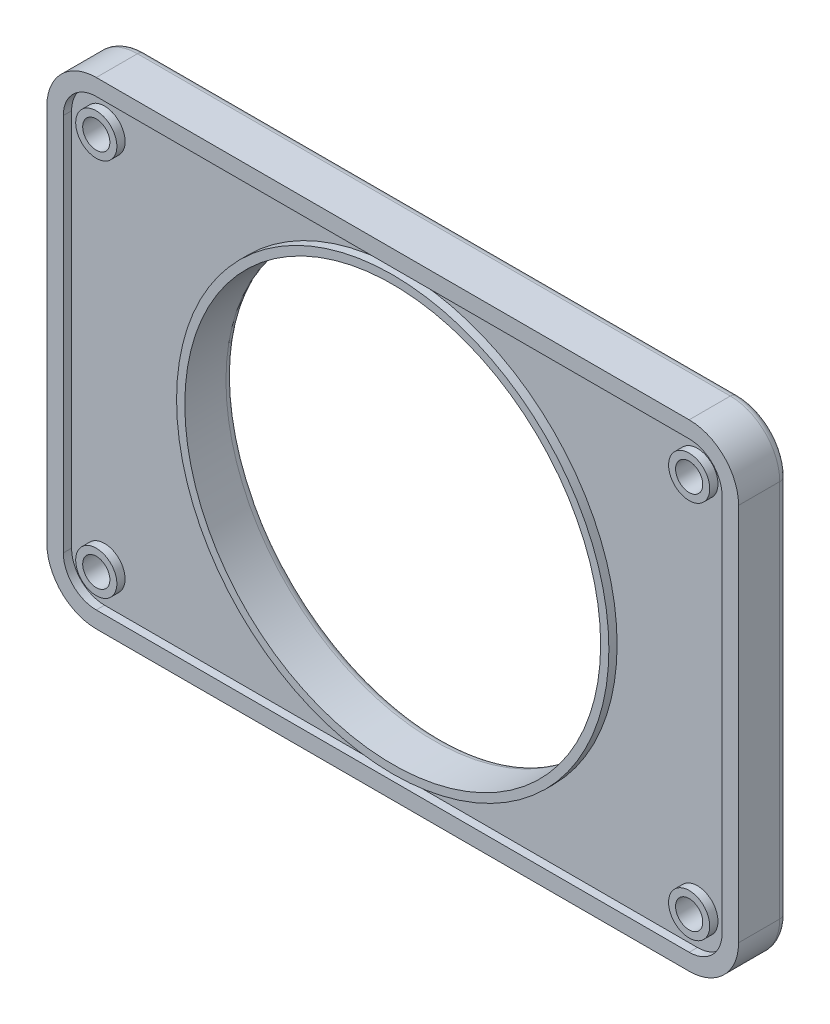
ISO-10303-21;
HEADER;
FILE_DESCRIPTION(('STEP AP214'),'2;1');
FILE_NAME('part.step','',(''),(''),'','','');
FILE_SCHEMA(('AUTOMOTIVE_DESIGN { 1 0 10303 214 1 1 1 1 }'));
ENDSEC;
DATA;
#1=APPLICATION_CONTEXT('core data for automotive mechanical design processes');
#2=APPLICATION_PROTOCOL_DEFINITION('international standard','automotive_design',2000,#1);
#3=PRODUCT_CONTEXT('',#1,'mechanical');
#4=PRODUCT('Part','Part','',(#3));
#5=PRODUCT_RELATED_PRODUCT_CATEGORY('part','',(#4));
#6=PRODUCT_DEFINITION_FORMATION('','',#4);
#7=PRODUCT_DEFINITION_CONTEXT('part definition',#1,'design');
#8=PRODUCT_DEFINITION('design','',#6,#7);
#9=PRODUCT_DEFINITION_SHAPE('','',#8);
#10=(LENGTH_UNIT() NAMED_UNIT(*) SI_UNIT(.MILLI.,.METRE.));
#11=(NAMED_UNIT(*) PLANE_ANGLE_UNIT() SI_UNIT($,.RADIAN.));
#12=(NAMED_UNIT(*) SI_UNIT($,.STERADIAN.) SOLID_ANGLE_UNIT());
#13=UNCERTAINTY_MEASURE_WITH_UNIT(LENGTH_MEASURE(1.E-05),#10,'distance_accuracy_value','');
#14=(GEOMETRIC_REPRESENTATION_CONTEXT(3) GLOBAL_UNCERTAINTY_ASSIGNED_CONTEXT((#13)) GLOBAL_UNIT_ASSIGNED_CONTEXT((#10,
#11,#12)) REPRESENTATION_CONTEXT('',''));
#15=CARTESIAN_POINT('',(0.,0.,0.));
#16=DIRECTION('',(0.,0.,1.));
#17=DIRECTION('',(1.,0.,0.));
#18=AXIS2_PLACEMENT_3D('',#15,#16,#17);
#19=CARTESIAN_POINT('',(36.,23.,5.));
#20=DIRECTION('',(0.,0.,1.));
#21=DIRECTION('',(1.,0.,0.));
#22=AXIS2_PLACEMENT_3D('',#19,#20,#21);
#23=PLANE('',#22);
#24=CARTESIAN_POINT('',(-36.,-23.,5.));
#25=DIRECTION('',(0.,0.,1.));
#26=DIRECTION('',(1.,0.,0.));
#27=AXIS2_PLACEMENT_3D('',#24,#25,#26);
#28=CIRCLE('',#27,2.5);
#29=CARTESIAN_POINT('',(-33.5,-23.,5.));
#30=VERTEX_POINT('',#29);
#31=EDGE_CURVE('E384',#30,#30,#28,.T.);
#32=ORIENTED_EDGE('',*,*,#31,.F.);
#33=EDGE_LOOP('',(#32));
#34=FACE_BOUND('',#33,.T.);
#35=CARTESIAN_POINT('',(-36.,23.,5.));
#36=DIRECTION('',(0.,0.,1.));
#37=DIRECTION('',(-1.,0.,0.));
#38=AXIS2_PLACEMENT_3D('',#35,#36,#37);
#39=CIRCLE('',#38,2.5);
#40=CARTESIAN_POINT('',(-38.5,23.,5.));
#41=VERTEX_POINT('',#40);
#42=EDGE_CURVE('E392',#41,#41,#39,.T.);
#43=ORIENTED_EDGE('',*,*,#42,.F.);
#44=EDGE_LOOP('',(#43));
#45=FACE_BOUND('',#44,.T.);
#46=CARTESIAN_POINT('',(36.,-23.,5.));
#47=DIRECTION('',(0.,0.,1.));
#48=DIRECTION('',(-1.,0.,0.));
#49=AXIS2_PLACEMENT_3D('',#46,#47,#48);
#50=CIRCLE('',#49,2.5);
#51=CARTESIAN_POINT('',(33.5,-23.,5.));
#52=VERTEX_POINT('',#51);
#53=EDGE_CURVE('E398',#52,#52,#50,.T.);
#54=ORIENTED_EDGE('',*,*,#53,.F.);
#55=EDGE_LOOP('',(#54));
#56=FACE_BOUND('',#55,.T.);
#57=CARTESIAN_POINT('',(36.,23.,5.));
#58=DIRECTION('',(0.,0.,1.));
#59=DIRECTION('',(1.,0.,0.));
#60=AXIS2_PLACEMENT_3D('',#57,#58,#59);
#61=CIRCLE('',#60,2.5);
#62=CARTESIAN_POINT('',(38.5,23.,5.));
#63=VERTEX_POINT('',#62);
#64=EDGE_CURVE('E404',#63,#63,#61,.T.);
#65=ORIENTED_EDGE('',*,*,#64,.F.);
#66=EDGE_LOOP('',(#65));
#67=FACE_BOUND('',#66,.T.);
#68=CARTESIAN_POINT('',(36.,23.,5.));
#69=DIRECTION('',(0.,0.,1.));
#70=DIRECTION('',(1.,0.,0.));
#71=AXIS2_PLACEMENT_3D('',#68,#69,#70);
#72=CIRCLE('',#71,4.);
#73=CARTESIAN_POINT('',(40.,23.,5.));
#74=VERTEX_POINT('',#73);
#75=CARTESIAN_POINT('',(36.,27.,5.));
#76=VERTEX_POINT('',#75);
#77=EDGE_CURVE('E179',#74,#76,#72,.T.);
#78=ORIENTED_EDGE('',*,*,#77,.T.);
#79=DIRECTION('',(-1.,0.,0.));
#80=VECTOR('',#79,1.);
#81=CARTESIAN_POINT('',(36.,27.,5.));
#82=LINE('',#81,#80);
#83=CARTESIAN_POINT('',(-36.,27.,5.));
#84=VERTEX_POINT('',#83);
#85=EDGE_CURVE('E190',#76,#84,#82,.T.);
#86=ORIENTED_EDGE('',*,*,#85,.T.);
#87=CARTESIAN_POINT('',(-36.,23.,5.));
#88=DIRECTION('',(0.,0.,1.));
#89=DIRECTION('',(1.,0.,0.));
#90=AXIS2_PLACEMENT_3D('',#87,#88,#89);
#91=CIRCLE('',#90,4.);
#92=CARTESIAN_POINT('',(-40.,23.,5.));
#93=VERTEX_POINT('',#92);
#94=EDGE_CURVE('E195',#84,#93,#91,.T.);
#95=ORIENTED_EDGE('',*,*,#94,.T.);
#96=DIRECTION('',(0.,-1.,0.));
#97=VECTOR('',#96,1.);
#98=CARTESIAN_POINT('',(-40.,23.,5.));
#99=LINE('',#98,#97);
#100=CARTESIAN_POINT('',(-40.,-23.,5.));
#101=VERTEX_POINT('',#100);
#102=EDGE_CURVE('E210',#93,#101,#99,.T.);
#103=ORIENTED_EDGE('',*,*,#102,.T.);
#104=CARTESIAN_POINT('',(-36.,-23.,5.));
#105=DIRECTION('',(0.,0.,1.));
#106=DIRECTION('',(1.,0.,0.));
#107=AXIS2_PLACEMENT_3D('',#104,#105,#106);
#108=CIRCLE('',#107,4.);
#109=CARTESIAN_POINT('',(-36.,-27.,5.));
#110=VERTEX_POINT('',#109);
#111=EDGE_CURVE('E213',#101,#110,#108,.T.);
#112=ORIENTED_EDGE('',*,*,#111,.T.);
#113=DIRECTION('',(1.,0.,0.));
#114=VECTOR('',#113,1.);
#115=CARTESIAN_POINT('',(-36.,-27.,5.));
#116=LINE('',#115,#114);
#117=CARTESIAN_POINT('',(36.,-27.,5.));
#118=VERTEX_POINT('',#117);
#119=EDGE_CURVE('E216',#110,#118,#116,.T.);
#120=ORIENTED_EDGE('',*,*,#119,.T.);
#121=CARTESIAN_POINT('',(36.,-23.,5.));
#122=DIRECTION('',(0.,0.,1.));
#123=DIRECTION('',(1.,0.,0.));
#124=AXIS2_PLACEMENT_3D('',#121,#122,#123);
#125=CIRCLE('',#124,4.);
#126=CARTESIAN_POINT('',(40.,-23.,5.));
#127=VERTEX_POINT('',#126);
#128=EDGE_CURVE('E219',#118,#127,#125,.T.);
#129=ORIENTED_EDGE('',*,*,#128,.T.);
#130=DIRECTION('',(0.,1.,0.));
#131=VECTOR('',#130,1.);
#132=CARTESIAN_POINT('',(40.,-23.,5.));
#133=LINE('',#132,#131);
#134=EDGE_CURVE('E187',#127,#74,#133,.T.);
#135=ORIENTED_EDGE('',*,*,#134,.T.);
#136=EDGE_LOOP('',(#78,#86,#95,#103,#112,#120,#129,#135));
#137=FACE_BOUND('',#136,.T.);
#138=CARTESIAN_POINT('',(0.,0.,5.));
#139=DIRECTION('',(0.,0.,1.));
#140=DIRECTION('',(1.,0.,0.));
#141=AXIS2_PLACEMENT_3D('',#138,#139,#140);
#142=CIRCLE('',#141,26.25);
#143=CARTESIAN_POINT('',(26.25,0.,5.));
#144=VERTEX_POINT('',#143);
#145=EDGE_CURVE('E206',#144,#144,#142,.T.);
#146=ORIENTED_EDGE('',*,*,#145,.F.);
#147=EDGE_LOOP('',(#146));
#148=FACE_BOUND('',#147,.T.);
#149=ADVANCED_FACE('F37',(#34,#45,#56,#67,#137,#148),#23,.T.);
#150=CARTESIAN_POINT('',(36.,23.,0.));
#151=DIRECTION('',(0.,0.,-1.));
#152=DIRECTION('',(-1.,0.,0.));
#153=AXIS2_PLACEMENT_3D('',#150,#151,#152);
#154=PLANE('',#153);
#155=CARTESIAN_POINT('',(0.,0.,0.));
#156=DIRECTION('',(0.,0.,-1.));
#157=DIRECTION('',(-1.,0.,0.));
#158=AXIS2_PLACEMENT_3D('',#155,#156,#157);
#159=CIRCLE('',#158,26.25);
#160=CARTESIAN_POINT('',(-26.25,0.,0.));
#161=VERTEX_POINT('',#160);
#162=EDGE_CURVE('E315',#161,#161,#159,.F.);
#163=ORIENTED_EDGE('',*,*,#162,.T.);
#164=EDGE_LOOP('',(#163));
#165=FACE_BOUND('',#164,.T.);
#166=CARTESIAN_POINT('',(-36.,23.,0.));
#167=DIRECTION('',(0.,0.,-1.));
#168=DIRECTION('',(-1.,0.,0.));
#169=AXIS2_PLACEMENT_3D('',#166,#167,#168);
#170=CIRCLE('',#169,5.);
#171=CARTESIAN_POINT('',(-41.,23.,0.));
#172=VERTEX_POINT('',#171);
#173=CARTESIAN_POINT('',(-36.,28.,0.));
#174=VERTEX_POINT('',#173);
#175=EDGE_CURVE('E310',#172,#174,#170,.T.);
#176=ORIENTED_EDGE('',*,*,#175,.T.);
#177=DIRECTION('',(-1.,0.,0.));
#178=VECTOR('',#177,1.);
#179=CARTESIAN_POINT('',(36.,28.,0.));
#180=LINE('',#179,#178);
#181=CARTESIAN_POINT('',(36.,28.,0.));
#182=VERTEX_POINT('',#181);
#183=EDGE_CURVE('E312',#174,#182,#180,.F.);
#184=ORIENTED_EDGE('',*,*,#183,.T.);
#185=CARTESIAN_POINT('',(36.,23.,0.));
#186=DIRECTION('',(0.,0.,-1.));
#187=DIRECTION('',(-1.,0.,0.));
#188=AXIS2_PLACEMENT_3D('',#185,#186,#187);
#189=CIRCLE('',#188,5.);
#190=CARTESIAN_POINT('',(41.,23.,0.));
#191=VERTEX_POINT('',#190);
#192=EDGE_CURVE('E298',#182,#191,#189,.T.);
#193=ORIENTED_EDGE('',*,*,#192,.T.);
#194=DIRECTION('',(0.,1.,0.));
#195=VECTOR('',#194,1.);
#196=CARTESIAN_POINT('',(41.,-23.,0.));
#197=LINE('',#196,#195);
#198=CARTESIAN_POINT('',(41.,-23.,0.));
#199=VERTEX_POINT('',#198);
#200=EDGE_CURVE('E300',#191,#199,#197,.F.);
#201=ORIENTED_EDGE('',*,*,#200,.T.);
#202=CARTESIAN_POINT('',(36.,-23.,0.));
#203=DIRECTION('',(0.,0.,-1.));
#204=DIRECTION('',(-1.,0.,0.));
#205=AXIS2_PLACEMENT_3D('',#202,#203,#204);
#206=CIRCLE('',#205,5.);
#207=CARTESIAN_POINT('',(36.,-28.,0.));
#208=VERTEX_POINT('',#207);
#209=EDGE_CURVE('E302',#199,#208,#206,.T.);
#210=ORIENTED_EDGE('',*,*,#209,.T.);
#211=DIRECTION('',(1.,0.,0.));
#212=VECTOR('',#211,1.);
#213=CARTESIAN_POINT('',(-35.9999999999999,-28.,0.));
#214=LINE('',#213,#212);
#215=CARTESIAN_POINT('',(-36.,-28.,0.));
#216=VERTEX_POINT('',#215);
#217=EDGE_CURVE('E304',#208,#216,#214,.F.);
#218=ORIENTED_EDGE('',*,*,#217,.T.);
#219=CARTESIAN_POINT('',(-36.,-23.,0.));
#220=DIRECTION('',(0.,0.,-1.));
#221=DIRECTION('',(-1.,0.,0.));
#222=AXIS2_PLACEMENT_3D('',#219,#220,#221);
#223=CIRCLE('',#222,5.);
#224=CARTESIAN_POINT('',(-41.,-23.,0.));
#225=VERTEX_POINT('',#224);
#226=EDGE_CURVE('E306',#216,#225,#223,.T.);
#227=ORIENTED_EDGE('',*,*,#226,.T.);
#228=DIRECTION('',(0.,-1.,0.));
#229=VECTOR('',#228,1.);
#230=CARTESIAN_POINT('',(-41.,23.,0.));
#231=LINE('',#230,#229);
#232=EDGE_CURVE('E308',#225,#172,#231,.F.);
#233=ORIENTED_EDGE('',*,*,#232,.T.);
#234=EDGE_LOOP('',(#176,#184,#193,#201,#210,#218,#227,#233));
#235=FACE_BOUND('',#234,.T.);
#236=ADVANCED_FACE('F420',(#165,#235),#154,.T.);
#237=CARTESIAN_POINT('',(36.,23.,5.));
#238=DIRECTION('',(0.,0.,-1.));
#239=DIRECTION('',(-1.,0.,0.));
#240=AXIS2_PLACEMENT_3D('',#237,#238,#239);
#241=CYLINDRICAL_SURFACE('',#240,6.);
#242=DIRECTION('',(0.,0.,-1.));
#243=VECTOR('',#242,1.);
#244=CARTESIAN_POINT('',(42.,23.,5.));
#245=LINE('',#244,#243);
#246=CARTESIAN_POINT('',(42.,23.,6.));
#247=VERTEX_POINT('',#246);
#248=CARTESIAN_POINT('',(42.,23.,1.));
#249=VERTEX_POINT('',#248);
#250=EDGE_CURVE('E277',#247,#249,#245,.T.);
#251=ORIENTED_EDGE('',*,*,#250,.T.);
#252=CARTESIAN_POINT('',(36.,23.,1.));
#253=DIRECTION('',(0.,0.,-1.));
#254=DIRECTION('',(-1.,0.,0.));
#255=AXIS2_PLACEMENT_3D('',#252,#253,#254);
#256=CIRCLE('',#255,6.);
#257=CARTESIAN_POINT('',(36.,29.,1.));
#258=VERTEX_POINT('',#257);
#259=EDGE_CURVE('E11',#249,#258,#256,.F.);
#260=ORIENTED_EDGE('',*,*,#259,.T.);
#261=DIRECTION('',(0.,0.,-1.));
#262=VECTOR('',#261,1.);
#263=CARTESIAN_POINT('',(36.,29.,5.));
#264=LINE('',#263,#262);
#265=CARTESIAN_POINT('',(36.,29.,6.));
#266=VERTEX_POINT('',#265);
#267=EDGE_CURVE('E295',#266,#258,#264,.T.);
#268=ORIENTED_EDGE('',*,*,#267,.F.);
#269=CARTESIAN_POINT('',(36.,23.,6.));
#270=DIRECTION('',(0.,0.,1.));
#271=DIRECTION('',(1.,0.,0.));
#272=AXIS2_PLACEMENT_3D('',#269,#270,#271);
#273=CIRCLE('',#272,6.);
#274=EDGE_CURVE('E242',#247,#266,#273,.T.);
#275=ORIENTED_EDGE('',*,*,#274,.F.);
#276=EDGE_LOOP('',(#251,#260,#268,#275));
#277=FACE_BOUND('',#276,.T.);
#278=ADVANCED_FACE('F426',(#277),#241,.T.);
#279=CARTESIAN_POINT('',(-36.,29.,5.));
#280=DIRECTION('',(0.,-1.,0.));
#281=DIRECTION('',(1.,0.,0.));
#282=AXIS2_PLACEMENT_3D('',#279,#280,#281);
#283=PLANE('',#282);
#284=ORIENTED_EDGE('',*,*,#267,.T.);
#285=DIRECTION('',(-1.,0.,0.));
#286=VECTOR('',#285,1.);
#287=CARTESIAN_POINT('',(-36.,29.,1.));
#288=LINE('',#287,#286);
#289=CARTESIAN_POINT('',(-36.,29.,1.));
#290=VERTEX_POINT('',#289);
#291=EDGE_CURVE('E321',#258,#290,#288,.T.);
#292=ORIENTED_EDGE('',*,*,#291,.T.);
#293=DIRECTION('',(0.,0.,-1.));
#294=VECTOR('',#293,1.);
#295=CARTESIAN_POINT('',(-36.,29.,5.));
#296=LINE('',#295,#294);
#297=CARTESIAN_POINT('',(-36.,29.,6.));
#298=VERTEX_POINT('',#297);
#299=EDGE_CURVE('E292',#298,#290,#296,.T.);
#300=ORIENTED_EDGE('',*,*,#299,.F.);
#301=DIRECTION('',(-1.,0.,0.));
#302=VECTOR('',#301,1.);
#303=CARTESIAN_POINT('',(36.,29.,6.));
#304=LINE('',#303,#302);
#305=EDGE_CURVE('E256',#266,#298,#304,.T.);
#306=ORIENTED_EDGE('',*,*,#305,.F.);
#307=EDGE_LOOP('',(#284,#292,#300,#306));
#308=FACE_BOUND('',#307,.T.);
#309=ADVANCED_FACE('F492',(#308),#283,.F.);
#310=CARTESIAN_POINT('',(-36.,23.,5.));
#311=DIRECTION('',(0.,0.,-1.));
#312=DIRECTION('',(-1.,0.,0.));
#313=AXIS2_PLACEMENT_3D('',#310,#311,#312);
#314=CYLINDRICAL_SURFACE('',#313,6.);
#315=ORIENTED_EDGE('',*,*,#299,.T.);
#316=CARTESIAN_POINT('',(-36.,23.,1.));
#317=DIRECTION('',(0.,0.,-1.));
#318=DIRECTION('',(-1.,0.,0.));
#319=AXIS2_PLACEMENT_3D('',#316,#317,#318);
#320=CIRCLE('',#319,6.);
#321=CARTESIAN_POINT('',(-42.,23.,1.));
#322=VERTEX_POINT('',#321);
#323=EDGE_CURVE('E324',#290,#322,#320,.F.);
#324=ORIENTED_EDGE('',*,*,#323,.T.);
#325=DIRECTION('',(0.,0.,-1.));
#326=VECTOR('',#325,1.);
#327=CARTESIAN_POINT('',(-42.,23.,5.));
#328=LINE('',#327,#326);
#329=CARTESIAN_POINT('',(-42.,23.,6.));
#330=VERTEX_POINT('',#329);
#331=EDGE_CURVE('E289',#330,#322,#328,.T.);
#332=ORIENTED_EDGE('',*,*,#331,.F.);
#333=CARTESIAN_POINT('',(-36.,23.,6.));
#334=DIRECTION('',(0.,0.,1.));
#335=DIRECTION('',(1.,0.,0.));
#336=AXIS2_PLACEMENT_3D('',#333,#334,#335);
#337=CIRCLE('',#336,6.);
#338=EDGE_CURVE('E259',#298,#330,#337,.T.);
#339=ORIENTED_EDGE('',*,*,#338,.F.);
#340=EDGE_LOOP('',(#315,#324,#332,#339));
#341=FACE_BOUND('',#340,.T.);
#342=ADVANCED_FACE('F488',(#341),#314,.T.);
#343=CARTESIAN_POINT('',(-42.,23.,5.));
#344=DIRECTION('',(1.,0.,0.));
#345=DIRECTION('',(0.,1.,0.));
#346=AXIS2_PLACEMENT_3D('',#343,#344,#345);
#347=PLANE('',#346);
#348=ORIENTED_EDGE('',*,*,#331,.T.);
#349=DIRECTION('',(0.,-1.,0.));
#350=VECTOR('',#349,1.);
#351=CARTESIAN_POINT('',(-42.,-23.,1.));
#352=LINE('',#351,#350);
#353=CARTESIAN_POINT('',(-42.,-23.,1.));
#354=VERTEX_POINT('',#353);
#355=EDGE_CURVE('E326',#322,#354,#352,.T.);
#356=ORIENTED_EDGE('',*,*,#355,.T.);
#357=DIRECTION('',(0.,0.,-1.));
#358=VECTOR('',#357,1.);
#359=CARTESIAN_POINT('',(-42.,-23.,5.));
#360=LINE('',#359,#358);
#361=CARTESIAN_POINT('',(-42.,-23.,6.));
#362=VERTEX_POINT('',#361);
#363=EDGE_CURVE('E286',#362,#354,#360,.T.);
#364=ORIENTED_EDGE('',*,*,#363,.F.);
#365=DIRECTION('',(0.,-1.,0.));
#366=VECTOR('',#365,1.);
#367=CARTESIAN_POINT('',(-42.,23.,6.));
#368=LINE('',#367,#366);
#369=EDGE_CURVE('E262',#330,#362,#368,.T.);
#370=ORIENTED_EDGE('',*,*,#369,.F.);
#371=EDGE_LOOP('',(#348,#356,#364,#370));
#372=FACE_BOUND('',#371,.T.);
#373=ADVANCED_FACE('F484',(#372),#347,.F.);
#374=CARTESIAN_POINT('',(-36.,-23.,5.));
#375=DIRECTION('',(0.,0.,-1.));
#376=DIRECTION('',(-1.,0.,0.));
#377=AXIS2_PLACEMENT_3D('',#374,#375,#376);
#378=CYLINDRICAL_SURFACE('',#377,6.);
#379=ORIENTED_EDGE('',*,*,#363,.T.);
#380=CARTESIAN_POINT('',(-36.,-23.,1.));
#381=DIRECTION('',(0.,0.,-1.));
#382=DIRECTION('',(-1.,0.,0.));
#383=AXIS2_PLACEMENT_3D('',#380,#381,#382);
#384=CIRCLE('',#383,6.);
#385=CARTESIAN_POINT('',(-35.9999999999999,-29.,1.));
#386=VERTEX_POINT('',#385);
#387=EDGE_CURVE('E328',#354,#386,#384,.F.);
#388=ORIENTED_EDGE('',*,*,#387,.T.);
#389=DIRECTION('',(0.,0.,-1.));
#390=VECTOR('',#389,1.);
#391=CARTESIAN_POINT('',(-35.9999999999999,-29.,5.));
#392=LINE('',#391,#390);
#393=CARTESIAN_POINT('',(-35.9999999999999,-29.,6.));
#394=VERTEX_POINT('',#393);
#395=EDGE_CURVE('E283',#394,#386,#392,.T.);
#396=ORIENTED_EDGE('',*,*,#395,.F.);
#397=CARTESIAN_POINT('',(-36.,-23.,6.));
#398=DIRECTION('',(0.,0.,1.));
#399=DIRECTION('',(1.,0.,0.));
#400=AXIS2_PLACEMENT_3D('',#397,#398,#399);
#401=CIRCLE('',#400,6.);
#402=EDGE_CURVE('E265',#362,#394,#401,.T.);
#403=ORIENTED_EDGE('',*,*,#402,.F.);
#404=EDGE_LOOP('',(#379,#388,#396,#403));
#405=FACE_BOUND('',#404,.T.);
#406=ADVANCED_FACE('F480',(#405),#378,.T.);
#407=CARTESIAN_POINT('',(-35.9999999999999,-29.,5.));
#408=DIRECTION('',(0.,1.,0.));
#409=DIRECTION('',(0.,0.,1.));
#410=AXIS2_PLACEMENT_3D('',#407,#408,#409);
#411=PLANE('',#410);
#412=ORIENTED_EDGE('',*,*,#395,.T.);
#413=DIRECTION('',(1.,0.,0.));
#414=VECTOR('',#413,1.);
#415=CARTESIAN_POINT('',(36.,-29.,1.));
#416=LINE('',#415,#414);
#417=CARTESIAN_POINT('',(36.,-29.,1.));
#418=VERTEX_POINT('',#417);
#419=EDGE_CURVE('E330',#386,#418,#416,.T.);
#420=ORIENTED_EDGE('',*,*,#419,.T.);
#421=DIRECTION('',(0.,0.,-1.));
#422=VECTOR('',#421,1.);
#423=CARTESIAN_POINT('',(36.,-29.,5.));
#424=LINE('',#423,#422);
#425=CARTESIAN_POINT('',(36.,-29.,6.));
#426=VERTEX_POINT('',#425);
#427=EDGE_CURVE('E281',#426,#418,#424,.T.);
#428=ORIENTED_EDGE('',*,*,#427,.F.);
#429=DIRECTION('',(1.,0.,0.));
#430=VECTOR('',#429,1.);
#431=CARTESIAN_POINT('',(-35.9999999999999,-29.,6.));
#432=LINE('',#431,#430);
#433=EDGE_CURVE('E268',#394,#426,#432,.T.);
#434=ORIENTED_EDGE('',*,*,#433,.F.);
#435=EDGE_LOOP('',(#412,#420,#428,#434));
#436=FACE_BOUND('',#435,.T.);
#437=ADVANCED_FACE('F477',(#436),#411,.F.);
#438=CARTESIAN_POINT('',(36.,-23.,5.));
#439=DIRECTION('',(0.,0.,-1.));
#440=DIRECTION('',(-1.,0.,0.));
#441=AXIS2_PLACEMENT_3D('',#438,#439,#440);
#442=CYLINDRICAL_SURFACE('',#441,6.);
#443=ORIENTED_EDGE('',*,*,#427,.T.);
#444=CARTESIAN_POINT('',(36.,-23.,1.));
#445=DIRECTION('',(0.,0.,-1.));
#446=DIRECTION('',(-1.,0.,0.));
#447=AXIS2_PLACEMENT_3D('',#444,#445,#446);
#448=CIRCLE('',#447,6.);
#449=CARTESIAN_POINT('',(42.,-23.,1.));
#450=VERTEX_POINT('',#449);
#451=EDGE_CURVE('E61',#418,#450,#448,.F.);
#452=ORIENTED_EDGE('',*,*,#451,.T.);
#453=DIRECTION('',(0.,0.,-1.));
#454=VECTOR('',#453,1.);
#455=CARTESIAN_POINT('',(42.,-23.,5.));
#456=LINE('',#455,#454);
#457=CARTESIAN_POINT('',(42.,-23.,6.));
#458=VERTEX_POINT('',#457);
#459=EDGE_CURVE('E279',#458,#450,#456,.T.);
#460=ORIENTED_EDGE('',*,*,#459,.F.);
#461=CARTESIAN_POINT('',(36.,-23.,6.));
#462=DIRECTION('',(0.,0.,1.));
#463=DIRECTION('',(1.,0.,0.));
#464=AXIS2_PLACEMENT_3D('',#461,#462,#463);
#465=CIRCLE('',#464,6.);
#466=EDGE_CURVE('E271',#426,#458,#465,.T.);
#467=ORIENTED_EDGE('',*,*,#466,.F.);
#468=EDGE_LOOP('',(#443,#452,#460,#467));
#469=FACE_BOUND('',#468,.T.);
#470=ADVANCED_FACE('F474',(#469),#442,.T.);
#471=CARTESIAN_POINT('',(42.,23.,5.));
#472=DIRECTION('',(-1.,0.,0.));
#473=DIRECTION('',(0.,-1.,0.));
#474=AXIS2_PLACEMENT_3D('',#471,#472,#473);
#475=PLANE('',#474);
#476=ORIENTED_EDGE('',*,*,#459,.T.);
#477=DIRECTION('',(0.,1.,0.));
#478=VECTOR('',#477,1.);
#479=CARTESIAN_POINT('',(42.,23.,1.));
#480=LINE('',#479,#478);
#481=EDGE_CURVE('E46',#450,#249,#480,.T.);
#482=ORIENTED_EDGE('',*,*,#481,.T.);
#483=ORIENTED_EDGE('',*,*,#250,.F.);
#484=DIRECTION('',(0.,1.,0.));
#485=VECTOR('',#484,1.);
#486=CARTESIAN_POINT('',(42.,-23.,6.));
#487=LINE('',#486,#485);
#488=EDGE_CURVE('E274',#458,#247,#487,.T.);
#489=ORIENTED_EDGE('',*,*,#488,.F.);
#490=EDGE_LOOP('',(#476,#482,#483,#489));
#491=FACE_BOUND('',#490,.T.);
#492=ADVANCED_FACE('F469',(#491),#475,.F.);
#493=CARTESIAN_POINT('',(0.,0.,5.));
#494=DIRECTION('',(0.,0.,-1.));
#495=DIRECTION('',(-1.,0.,0.));
#496=AXIS2_PLACEMENT_3D('',#493,#494,#495);
#497=CYLINDRICAL_SURFACE('',#496,25.25);
#498=CARTESIAN_POINT('',(0.,0.,1.));
#499=DIRECTION('',(0.,0.,-1.));
#500=DIRECTION('',(-1.,0.,0.));
#501=AXIS2_PLACEMENT_3D('',#498,#499,#500);
#502=CIRCLE('',#501,25.25);
#503=CARTESIAN_POINT('',(-25.25,0.,1.));
#504=VERTEX_POINT('',#503);
#505=EDGE_CURVE('E318',#504,#504,#502,.T.);
#506=ORIENTED_EDGE('',*,*,#505,.T.);
#507=EDGE_LOOP('',(#506));
#508=FACE_BOUND('',#507,.T.);
#509=CARTESIAN_POINT('',(0.,0.,6.));
#510=DIRECTION('',(0.,0.,1.));
#511=DIRECTION('',(1.,0.,0.));
#512=AXIS2_PLACEMENT_3D('',#509,#510,#511);
#513=CIRCLE('',#512,25.25);
#514=CARTESIAN_POINT('',(25.25,0.,6.));
#515=VERTEX_POINT('',#514);
#516=EDGE_CURVE('E410',#515,#515,#513,.T.);
#517=ORIENTED_EDGE('',*,*,#516,.T.);
#518=EDGE_LOOP('',(#517));
#519=FACE_BOUND('',#518,.T.);
#520=ADVANCED_FACE('F466',(#508,#519),#497,.F.);
#521=CARTESIAN_POINT('',(36.,23.,6.));
#522=DIRECTION('',(0.,0.,1.));
#523=DIRECTION('',(1.,0.,0.));
#524=AXIS2_PLACEMENT_3D('',#521,#522,#523);
#525=PLANE('',#524);
#526=CARTESIAN_POINT('',(36.,23.,6.));
#527=DIRECTION('',(0.,0.,1.));
#528=DIRECTION('',(1.,0.,0.));
#529=AXIS2_PLACEMENT_3D('',#526,#527,#528);
#530=CIRCLE('',#529,4.);
#531=CARTESIAN_POINT('',(40.,23.,6.));
#532=VERTEX_POINT('',#531);
#533=CARTESIAN_POINT('',(36.,27.,6.));
#534=VERTEX_POINT('',#533);
#535=EDGE_CURVE('E182',#532,#534,#530,.T.);
#536=ORIENTED_EDGE('',*,*,#535,.F.);
#537=DIRECTION('',(0.,1.,0.));
#538=VECTOR('',#537,1.);
#539=CARTESIAN_POINT('',(40.,-23.,6.));
#540=LINE('',#539,#538);
#541=CARTESIAN_POINT('',(40.,-23.,6.));
#542=VERTEX_POINT('',#541);
#543=EDGE_CURVE('E200',#542,#532,#540,.T.);
#544=ORIENTED_EDGE('',*,*,#543,.F.);
#545=CARTESIAN_POINT('',(36.,-23.,6.));
#546=DIRECTION('',(0.,0.,1.));
#547=DIRECTION('',(1.,0.,0.));
#548=AXIS2_PLACEMENT_3D('',#545,#546,#547);
#549=CIRCLE('',#548,4.);
#550=CARTESIAN_POINT('',(36.,-27.,6.));
#551=VERTEX_POINT('',#550);
#552=EDGE_CURVE('E203',#551,#542,#549,.T.);
#553=ORIENTED_EDGE('',*,*,#552,.F.);
#554=DIRECTION('',(1.,0.,0.));
#555=VECTOR('',#554,1.);
#556=CARTESIAN_POINT('',(-36.,-27.,6.));
#557=LINE('',#556,#555);
#558=CARTESIAN_POINT('',(-36.,-27.,6.));
#559=VERTEX_POINT('',#558);
#560=EDGE_CURVE('E235',#559,#551,#557,.T.);
#561=ORIENTED_EDGE('',*,*,#560,.F.);
#562=CARTESIAN_POINT('',(-36.,-23.,6.));
#563=DIRECTION('',(0.,0.,1.));
#564=DIRECTION('',(1.,0.,0.));
#565=AXIS2_PLACEMENT_3D('',#562,#563,#564);
#566=CIRCLE('',#565,4.);
#567=CARTESIAN_POINT('',(-40.,-23.,6.));
#568=VERTEX_POINT('',#567);
#569=EDGE_CURVE('E232',#568,#559,#566,.T.);
#570=ORIENTED_EDGE('',*,*,#569,.F.);
#571=DIRECTION('',(0.,-1.,0.));
#572=VECTOR('',#571,1.);
#573=CARTESIAN_POINT('',(-40.,23.,6.));
#574=LINE('',#573,#572);
#575=CARTESIAN_POINT('',(-40.,23.,6.));
#576=VERTEX_POINT('',#575);
#577=EDGE_CURVE('E229',#576,#568,#574,.T.);
#578=ORIENTED_EDGE('',*,*,#577,.F.);
#579=CARTESIAN_POINT('',(-36.,23.,6.));
#580=DIRECTION('',(0.,0.,1.));
#581=DIRECTION('',(1.,0.,0.));
#582=AXIS2_PLACEMENT_3D('',#579,#580,#581);
#583=CIRCLE('',#582,4.);
#584=CARTESIAN_POINT('',(-36.,27.,6.));
#585=VERTEX_POINT('',#584);
#586=EDGE_CURVE('E226',#585,#576,#583,.T.);
#587=ORIENTED_EDGE('',*,*,#586,.F.);
#588=DIRECTION('',(-1.,0.,0.));
#589=VECTOR('',#588,1.);
#590=CARTESIAN_POINT('',(36.,27.,6.));
#591=LINE('',#590,#589);
#592=EDGE_CURVE('E223',#534,#585,#591,.T.);
#593=ORIENTED_EDGE('',*,*,#592,.F.);
#594=EDGE_LOOP('',(#536,#544,#553,#561,#570,#578,#587,#593));
#595=FACE_BOUND('',#594,.T.);
#596=ORIENTED_EDGE('',*,*,#274,.T.);
#597=ORIENTED_EDGE('',*,*,#305,.T.);
#598=ORIENTED_EDGE('',*,*,#338,.T.);
#599=ORIENTED_EDGE('',*,*,#369,.T.);
#600=ORIENTED_EDGE('',*,*,#402,.T.);
#601=ORIENTED_EDGE('',*,*,#433,.T.);
#602=ORIENTED_EDGE('',*,*,#466,.T.);
#603=ORIENTED_EDGE('',*,*,#488,.T.);
#604=EDGE_LOOP('',(#596,#597,#598,#599,#600,#601,#602,#603));
#605=FACE_BOUND('',#604,.T.);
#606=ADVANCED_FACE('F463',(#595,#605),#525,.T.);
#607=CARTESIAN_POINT('',(36.,23.,5.));
#608=DIRECTION('',(0.,0.,1.));
#609=DIRECTION('',(1.,0.,0.));
#610=AXIS2_PLACEMENT_3D('',#607,#608,#609);
#611=CYLINDRICAL_SURFACE('',#610,4.);
#612=ORIENTED_EDGE('',*,*,#535,.T.);
#613=DIRECTION('',(0.,0.,1.));
#614=VECTOR('',#613,1.);
#615=CARTESIAN_POINT('',(36.,27.,5.));
#616=LINE('',#615,#614);
#617=EDGE_CURVE('E175',#76,#534,#616,.T.);
#618=ORIENTED_EDGE('',*,*,#617,.F.);
#619=ORIENTED_EDGE('',*,*,#77,.F.);
#620=DIRECTION('',(0.,0.,1.));
#621=VECTOR('',#620,1.);
#622=CARTESIAN_POINT('',(40.,23.,5.));
#623=LINE('',#622,#621);
#624=EDGE_CURVE('E240',#74,#532,#623,.T.);
#625=ORIENTED_EDGE('',*,*,#624,.T.);
#626=EDGE_LOOP('',(#612,#618,#619,#625));
#627=FACE_BOUND('',#626,.T.);
#628=ADVANCED_FACE('F177',(#627),#611,.F.);
#629=CARTESIAN_POINT('',(40.,-23.,5.));
#630=DIRECTION('',(1.,0.,0.));
#631=DIRECTION('',(0.,1.,0.));
#632=AXIS2_PLACEMENT_3D('',#629,#630,#631);
#633=PLANE('',#632);
#634=ORIENTED_EDGE('',*,*,#543,.T.);
#635=ORIENTED_EDGE('',*,*,#624,.F.);
#636=ORIENTED_EDGE('',*,*,#134,.F.);
#637=DIRECTION('',(0.,0.,1.));
#638=VECTOR('',#637,1.);
#639=CARTESIAN_POINT('',(40.,-23.,5.));
#640=LINE('',#639,#638);
#641=EDGE_CURVE('E243',#127,#542,#640,.T.);
#642=ORIENTED_EDGE('',*,*,#641,.T.);
#643=EDGE_LOOP('',(#634,#635,#636,#642));
#644=FACE_BOUND('',#643,.T.);
#645=ADVANCED_FACE('F434',(#644),#633,.F.);
#646=CARTESIAN_POINT('',(36.,-23.,5.));
#647=DIRECTION('',(0.,0.,1.));
#648=DIRECTION('',(1.,0.,0.));
#649=AXIS2_PLACEMENT_3D('',#646,#647,#648);
#650=CYLINDRICAL_SURFACE('',#649,4.);
#651=ORIENTED_EDGE('',*,*,#552,.T.);
#652=ORIENTED_EDGE('',*,*,#641,.F.);
#653=ORIENTED_EDGE('',*,*,#128,.F.);
#654=DIRECTION('',(0.,0.,1.));
#655=VECTOR('',#654,1.);
#656=CARTESIAN_POINT('',(36.,-27.,5.));
#657=LINE('',#656,#655);
#658=EDGE_CURVE('E245',#118,#551,#657,.T.);
#659=ORIENTED_EDGE('',*,*,#658,.T.);
#660=EDGE_LOOP('',(#651,#652,#653,#659));
#661=FACE_BOUND('',#660,.T.);
#662=ADVANCED_FACE('F437',(#661),#650,.F.);
#663=CARTESIAN_POINT('',(-36.,-27.,5.));
#664=DIRECTION('',(0.,-1.,0.));
#665=DIRECTION('',(1.,0.,0.));
#666=AXIS2_PLACEMENT_3D('',#663,#664,#665);
#667=PLANE('',#666);
#668=ORIENTED_EDGE('',*,*,#560,.T.);
#669=ORIENTED_EDGE('',*,*,#658,.F.);
#670=ORIENTED_EDGE('',*,*,#119,.F.);
#671=DIRECTION('',(0.,0.,1.));
#672=VECTOR('',#671,1.);
#673=CARTESIAN_POINT('',(-36.,-27.,5.));
#674=LINE('',#673,#672);
#675=EDGE_CURVE('E247',#110,#559,#674,.T.);
#676=ORIENTED_EDGE('',*,*,#675,.T.);
#677=EDGE_LOOP('',(#668,#669,#670,#676));
#678=FACE_BOUND('',#677,.T.);
#679=ADVANCED_FACE('F441',(#678),#667,.F.);
#680=CARTESIAN_POINT('',(-36.,-23.,5.));
#681=DIRECTION('',(0.,0.,1.));
#682=DIRECTION('',(1.,0.,0.));
#683=AXIS2_PLACEMENT_3D('',#680,#681,#682);
#684=CYLINDRICAL_SURFACE('',#683,4.);
#685=ORIENTED_EDGE('',*,*,#569,.T.);
#686=ORIENTED_EDGE('',*,*,#675,.F.);
#687=ORIENTED_EDGE('',*,*,#111,.F.);
#688=DIRECTION('',(0.,0.,1.));
#689=VECTOR('',#688,1.);
#690=CARTESIAN_POINT('',(-40.,-23.,5.));
#691=LINE('',#690,#689);
#692=EDGE_CURVE('E249',#101,#568,#691,.T.);
#693=ORIENTED_EDGE('',*,*,#692,.T.);
#694=EDGE_LOOP('',(#685,#686,#687,#693));
#695=FACE_BOUND('',#694,.T.);
#696=ADVANCED_FACE('F445',(#695),#684,.F.);
#697=CARTESIAN_POINT('',(-40.,23.,5.));
#698=DIRECTION('',(-1.,0.,0.));
#699=DIRECTION('',(0.,-1.,0.));
#700=AXIS2_PLACEMENT_3D('',#697,#698,#699);
#701=PLANE('',#700);
#702=ORIENTED_EDGE('',*,*,#577,.T.);
#703=ORIENTED_EDGE('',*,*,#692,.F.);
#704=ORIENTED_EDGE('',*,*,#102,.F.);
#705=DIRECTION('',(0.,0.,1.));
#706=VECTOR('',#705,1.);
#707=CARTESIAN_POINT('',(-40.,23.,5.));
#708=LINE('',#707,#706);
#709=EDGE_CURVE('E251',#93,#576,#708,.T.);
#710=ORIENTED_EDGE('',*,*,#709,.T.);
#711=EDGE_LOOP('',(#702,#703,#704,#710));
#712=FACE_BOUND('',#711,.T.);
#713=ADVANCED_FACE('F449',(#712),#701,.F.);
#714=CARTESIAN_POINT('',(-36.,23.,5.));
#715=DIRECTION('',(0.,0.,1.));
#716=DIRECTION('',(1.,0.,0.));
#717=AXIS2_PLACEMENT_3D('',#714,#715,#716);
#718=CYLINDRICAL_SURFACE('',#717,4.);
#719=ORIENTED_EDGE('',*,*,#586,.T.);
#720=ORIENTED_EDGE('',*,*,#709,.F.);
#721=ORIENTED_EDGE('',*,*,#94,.F.);
#722=DIRECTION('',(0.,0.,1.));
#723=VECTOR('',#722,1.);
#724=CARTESIAN_POINT('',(-36.,27.,5.));
#725=LINE('',#724,#723);
#726=EDGE_CURVE('E186',#84,#585,#725,.T.);
#727=ORIENTED_EDGE('',*,*,#726,.T.);
#728=EDGE_LOOP('',(#719,#720,#721,#727));
#729=FACE_BOUND('',#728,.T.);
#730=ADVANCED_FACE('F453',(#729),#718,.F.);
#731=CARTESIAN_POINT('',(36.,27.,5.));
#732=DIRECTION('',(0.,1.,0.));
#733=DIRECTION('',(0.,0.,1.));
#734=AXIS2_PLACEMENT_3D('',#731,#732,#733);
#735=PLANE('',#734);
#736=ORIENTED_EDGE('',*,*,#592,.T.);
#737=ORIENTED_EDGE('',*,*,#726,.F.);
#738=ORIENTED_EDGE('',*,*,#85,.F.);
#739=ORIENTED_EDGE('',*,*,#617,.T.);
#740=EDGE_LOOP('',(#736,#737,#738,#739));
#741=FACE_BOUND('',#740,.T.);
#742=ADVANCED_FACE('F191',(#741),#735,.F.);
#743=CARTESIAN_POINT('',(0.,0.,6.));
#744=DIRECTION('',(0.,0.,1.));
#745=DIRECTION('',(1.,0.,0.));
#746=AXIS2_PLACEMENT_3D('',#743,#744,#745);
#747=PLANE('',#746);
#748=CARTESIAN_POINT('',(0.,0.,6.));
#749=DIRECTION('',(0.,0.,1.));
#750=DIRECTION('',(1.,0.,0.));
#751=AXIS2_PLACEMENT_3D('',#748,#749,#750);
#752=CIRCLE('',#751,26.25);
#753=CARTESIAN_POINT('',(26.25,0.,6.));
#754=VERTEX_POINT('',#753);
#755=EDGE_CURVE('E224',#754,#754,#752,.T.);
#756=ORIENTED_EDGE('',*,*,#755,.T.);
#757=EDGE_LOOP('',(#756));
#758=FACE_BOUND('',#757,.T.);
#759=ORIENTED_EDGE('',*,*,#516,.F.);
#760=EDGE_LOOP('',(#759));
#761=FACE_BOUND('',#760,.T.);
#762=ADVANCED_FACE('F460',(#758,#761),#747,.T.);
#763=CARTESIAN_POINT('',(0.,0.,6.));
#764=DIRECTION('',(0.,0.,-1.));
#765=DIRECTION('',(-1.,0.,0.));
#766=AXIS2_PLACEMENT_3D('',#763,#764,#765);
#767=CYLINDRICAL_SURFACE('',#766,26.25);
#768=ORIENTED_EDGE('',*,*,#755,.F.);
#769=EDGE_LOOP('',(#768));
#770=FACE_BOUND('',#769,.T.);
#771=ORIENTED_EDGE('',*,*,#145,.T.);
#772=EDGE_LOOP('',(#771));
#773=FACE_BOUND('',#772,.T.);
#774=ADVANCED_FACE('F418',(#770,#773),#767,.T.);
#775=CARTESIAN_POINT('',(36.,23.,13.0710678118655));
#776=DIRECTION('',(0.,0.,-1.));
#777=DIRECTION('',(-1.,0.,0.));
#778=AXIS2_PLACEMENT_3D('',#775,#776,#777);
#779=CYLINDRICAL_SURFACE('',#778,2.5);
#780=ORIENTED_EDGE('',*,*,#64,.T.);
#781=EDGE_LOOP('',(#780));
#782=FACE_BOUND('',#781,.T.);
#783=CARTESIAN_POINT('',(36.,23.,6.));
#784=DIRECTION('',(0.,0.,1.));
#785=DIRECTION('',(1.,0.,0.));
#786=AXIS2_PLACEMENT_3D('',#783,#784,#785);
#787=CIRCLE('',#786,2.5);
#788=CARTESIAN_POINT('',(38.5,23.,6.));
#789=VERTEX_POINT('',#788);
#790=EDGE_CURVE('E407',#789,#789,#787,.T.);
#791=ORIENTED_EDGE('',*,*,#790,.F.);
#792=EDGE_LOOP('',(#791));
#793=FACE_BOUND('',#792,.T.);
#794=ADVANCED_FACE('F687',(#782,#793),#779,.T.);
#795=CARTESIAN_POINT('',(36.,23.,6.));
#796=DIRECTION('',(0.,0.,1.));
#797=DIRECTION('',(1.,0.,0.));
#798=AXIS2_PLACEMENT_3D('',#795,#796,#797);
#799=PLANE('',#798);
#800=CARTESIAN_POINT('',(36.,23.,6.));
#801=DIRECTION('',(0.,0.,1.));
#802=DIRECTION('',(1.,0.,0.));
#803=AXIS2_PLACEMENT_3D('',#800,#801,#802);
#804=CIRCLE('',#803,1.65);
#805=CARTESIAN_POINT('',(37.65,23.,6.));
#806=VERTEX_POINT('',#805);
#807=EDGE_CURVE('E372',#806,#806,#804,.T.);
#808=ORIENTED_EDGE('',*,*,#807,.F.);
#809=EDGE_LOOP('',(#808));
#810=FACE_BOUND('',#809,.T.);
#811=ORIENTED_EDGE('',*,*,#790,.T.);
#812=EDGE_LOOP('',(#811));
#813=FACE_BOUND('',#812,.T.);
#814=ADVANCED_FACE('F679',(#810,#813),#799,.T.);
#815=CARTESIAN_POINT('',(36.,-23.,13.0710678118655));
#816=DIRECTION('',(0.,0.,-1.));
#817=DIRECTION('',(-1.,0.,0.));
#818=AXIS2_PLACEMENT_3D('',#815,#816,#817);
#819=CYLINDRICAL_SURFACE('',#818,2.5);
#820=ORIENTED_EDGE('',*,*,#53,.T.);
#821=EDGE_LOOP('',(#820));
#822=FACE_BOUND('',#821,.T.);
#823=CARTESIAN_POINT('',(36.,-23.,6.));
#824=DIRECTION('',(0.,0.,1.));
#825=DIRECTION('',(1.,0.,0.));
#826=AXIS2_PLACEMENT_3D('',#823,#824,#825);
#827=CIRCLE('',#826,2.5);
#828=CARTESIAN_POINT('',(38.5,-23.,6.));
#829=VERTEX_POINT('',#828);
#830=EDGE_CURVE('E401',#829,#829,#827,.T.);
#831=ORIENTED_EDGE('',*,*,#830,.F.);
#832=EDGE_LOOP('',(#831));
#833=FACE_BOUND('',#832,.T.);
#834=ADVANCED_FACE('F672',(#822,#833),#819,.T.);
#835=CARTESIAN_POINT('',(36.,23.,6.));
#836=DIRECTION('',(0.,0.,1.));
#837=DIRECTION('',(1.,0.,0.));
#838=AXIS2_PLACEMENT_3D('',#835,#836,#837);
#839=PLANE('',#838);
#840=CARTESIAN_POINT('',(36.,-23.,6.));
#841=DIRECTION('',(0.,0.,1.));
#842=DIRECTION('',(-1.,0.,0.));
#843=AXIS2_PLACEMENT_3D('',#840,#841,#842);
#844=CIRCLE('',#843,1.65);
#845=CARTESIAN_POINT('',(34.35,-23.,6.));
#846=VERTEX_POINT('',#845);
#847=EDGE_CURVE('E373',#846,#846,#844,.T.);
#848=ORIENTED_EDGE('',*,*,#847,.F.);
#849=EDGE_LOOP('',(#848));
#850=FACE_BOUND('',#849,.T.);
#851=ORIENTED_EDGE('',*,*,#830,.T.);
#852=EDGE_LOOP('',(#851));
#853=FACE_BOUND('',#852,.T.);
#854=ADVANCED_FACE('F664',(#850,#853),#839,.T.);
#855=CARTESIAN_POINT('',(-36.,23.,13.0710678118655));
#856=DIRECTION('',(0.,0.,-1.));
#857=DIRECTION('',(-1.,0.,0.));
#858=AXIS2_PLACEMENT_3D('',#855,#856,#857);
#859=CYLINDRICAL_SURFACE('',#858,2.5);
#860=ORIENTED_EDGE('',*,*,#42,.T.);
#861=EDGE_LOOP('',(#860));
#862=FACE_BOUND('',#861,.T.);
#863=CARTESIAN_POINT('',(-36.,23.,6.));
#864=DIRECTION('',(0.,0.,1.));
#865=DIRECTION('',(1.,0.,0.));
#866=AXIS2_PLACEMENT_3D('',#863,#864,#865);
#867=CIRCLE('',#866,2.5);
#868=CARTESIAN_POINT('',(-33.5,23.,6.));
#869=VERTEX_POINT('',#868);
#870=EDGE_CURVE('E395',#869,#869,#867,.T.);
#871=ORIENTED_EDGE('',*,*,#870,.F.);
#872=EDGE_LOOP('',(#871));
#873=FACE_BOUND('',#872,.T.);
#874=ADVANCED_FACE('F656',(#862,#873),#859,.T.);
#875=CARTESIAN_POINT('',(36.,23.,6.));
#876=DIRECTION('',(0.,0.,1.));
#877=DIRECTION('',(1.,0.,0.));
#878=AXIS2_PLACEMENT_3D('',#875,#876,#877);
#879=PLANE('',#878);
#880=CARTESIAN_POINT('',(-36.,23.,6.));
#881=DIRECTION('',(0.,0.,1.));
#882=DIRECTION('',(-1.,0.,0.));
#883=AXIS2_PLACEMENT_3D('',#880,#881,#882);
#884=CIRCLE('',#883,1.65);
#885=CARTESIAN_POINT('',(-37.65,23.,6.));
#886=VERTEX_POINT('',#885);
#887=EDGE_CURVE('E366',#886,#886,#884,.T.);
#888=ORIENTED_EDGE('',*,*,#887,.F.);
#889=EDGE_LOOP('',(#888));
#890=FACE_BOUND('',#889,.T.);
#891=ORIENTED_EDGE('',*,*,#870,.T.);
#892=EDGE_LOOP('',(#891));
#893=FACE_BOUND('',#892,.T.);
#894=ADVANCED_FACE('F647',(#890,#893),#879,.T.);
#895=CARTESIAN_POINT('',(-36.,-23.,13.0710678118655));
#896=DIRECTION('',(0.,0.,-1.));
#897=DIRECTION('',(-1.,0.,0.));
#898=AXIS2_PLACEMENT_3D('',#895,#896,#897);
#899=CYLINDRICAL_SURFACE('',#898,2.5);
#900=ORIENTED_EDGE('',*,*,#31,.T.);
#901=EDGE_LOOP('',(#900));
#902=FACE_BOUND('',#901,.T.);
#903=CARTESIAN_POINT('',(-36.,-23.,6.));
#904=DIRECTION('',(0.,0.,1.));
#905=DIRECTION('',(1.,0.,0.));
#906=AXIS2_PLACEMENT_3D('',#903,#904,#905);
#907=CIRCLE('',#906,2.5);
#908=CARTESIAN_POINT('',(-33.5,-23.,6.));
#909=VERTEX_POINT('',#908);
#910=EDGE_CURVE('E389',#909,#909,#907,.T.);
#911=ORIENTED_EDGE('',*,*,#910,.F.);
#912=EDGE_LOOP('',(#911));
#913=FACE_BOUND('',#912,.T.);
#914=ADVANCED_FACE('F638',(#902,#913),#899,.T.);
#915=CARTESIAN_POINT('',(36.,23.,6.));
#916=DIRECTION('',(0.,0.,1.));
#917=DIRECTION('',(1.,0.,0.));
#918=AXIS2_PLACEMENT_3D('',#915,#916,#917);
#919=PLANE('',#918);
#920=CARTESIAN_POINT('',(-36.,-23.,6.));
#921=DIRECTION('',(0.,0.,1.));
#922=DIRECTION('',(1.,0.,0.));
#923=AXIS2_PLACEMENT_3D('',#920,#921,#922);
#924=CIRCLE('',#923,1.65);
#925=CARTESIAN_POINT('',(-34.35,-23.,6.));
#926=VERTEX_POINT('',#925);
#927=EDGE_CURVE('E356',#926,#926,#924,.T.);
#928=ORIENTED_EDGE('',*,*,#927,.F.);
#929=EDGE_LOOP('',(#928));
#930=FACE_BOUND('',#929,.T.);
#931=ORIENTED_EDGE('',*,*,#910,.T.);
#932=EDGE_LOOP('',(#931));
#933=FACE_BOUND('',#932,.T.);
#934=ADVANCED_FACE('F630',(#930,#933),#919,.T.);
#935=CARTESIAN_POINT('',(-36.,-23.,2.5));
#936=DIRECTION('',(0.,0.,1.));
#937=DIRECTION('',(1.,0.,0.));
#938=AXIS2_PLACEMENT_3D('',#935,#936,#937);
#939=CYLINDRICAL_SURFACE('',#938,1.65);
#940=CARTESIAN_POINT('',(-36.,-23.,2.5));
#941=DIRECTION('',(0.,0.,1.));
#942=DIRECTION('',(1.,0.,0.));
#943=AXIS2_PLACEMENT_3D('',#940,#941,#942);
#944=CIRCLE('',#943,1.65);
#945=CARTESIAN_POINT('',(-34.35,-23.,2.5));
#946=VERTEX_POINT('',#945);
#947=EDGE_CURVE('E361',#946,#946,#944,.T.);
#948=ORIENTED_EDGE('',*,*,#947,.F.);
#949=EDGE_LOOP('',(#948));
#950=FACE_BOUND('',#949,.T.);
#951=ORIENTED_EDGE('',*,*,#927,.T.);
#952=EDGE_LOOP('',(#951));
#953=FACE_BOUND('',#952,.T.);
#954=ADVANCED_FACE('F622',(#950,#953),#939,.F.);
#955=CARTESIAN_POINT('',(-36.,-23.,2.5));
#956=DIRECTION('',(0.,0.,1.));
#957=DIRECTION('',(1.,0.,0.));
#958=AXIS2_PLACEMENT_3D('',#955,#956,#957);
#959=PLANE('',#958);
#960=ORIENTED_EDGE('',*,*,#947,.T.);
#961=EDGE_LOOP('',(#960));
#962=FACE_BOUND('',#961,.T.);
#963=ADVANCED_FACE('F614',(#962),#959,.T.);
#964=CARTESIAN_POINT('',(-36.,23.,2.5));
#965=DIRECTION('',(0.,0.,1.));
#966=DIRECTION('',(1.,0.,0.));
#967=AXIS2_PLACEMENT_3D('',#964,#965,#966);
#968=CYLINDRICAL_SURFACE('',#967,1.65);
#969=CARTESIAN_POINT('',(-36.,23.,2.5));
#970=DIRECTION('',(0.,0.,1.));
#971=DIRECTION('',(-1.,0.,0.));
#972=AXIS2_PLACEMENT_3D('',#969,#970,#971);
#973=CIRCLE('',#972,1.65);
#974=CARTESIAN_POINT('',(-37.65,23.,2.5));
#975=VERTEX_POINT('',#974);
#976=EDGE_CURVE('E376',#975,#975,#973,.T.);
#977=ORIENTED_EDGE('',*,*,#976,.F.);
#978=EDGE_LOOP('',(#977));
#979=FACE_BOUND('',#978,.T.);
#980=ORIENTED_EDGE('',*,*,#887,.T.);
#981=EDGE_LOOP('',(#980));
#982=FACE_BOUND('',#981,.T.);
#983=ADVANCED_FACE('F606',(#979,#982),#968,.F.);
#984=CARTESIAN_POINT('',(-36.,23.,2.5));
#985=DIRECTION('',(0.,0.,-1.));
#986=DIRECTION('',(-1.,0.,0.));
#987=AXIS2_PLACEMENT_3D('',#984,#985,#986);
#988=PLANE('',#987);
#989=ORIENTED_EDGE('',*,*,#976,.T.);
#990=EDGE_LOOP('',(#989));
#991=FACE_BOUND('',#990,.T.);
#992=ADVANCED_FACE('F598',(#991),#988,.F.);
#993=CARTESIAN_POINT('',(36.,-23.,2.5));
#994=DIRECTION('',(0.,0.,1.));
#995=DIRECTION('',(1.,0.,0.));
#996=AXIS2_PLACEMENT_3D('',#993,#994,#995);
#997=CYLINDRICAL_SURFACE('',#996,1.65);
#998=CARTESIAN_POINT('',(36.,-23.,2.5));
#999=DIRECTION('',(0.,0.,1.));
#1000=DIRECTION('',(-1.,0.,0.));
#1001=AXIS2_PLACEMENT_3D('',#998,#999,#1000);
#1002=CIRCLE('',#1001,1.65);
#1003=CARTESIAN_POINT('',(34.35,-23.,2.5));
#1004=VERTEX_POINT('',#1003);
#1005=EDGE_CURVE('E369',#1004,#1004,#1002,.T.);
#1006=ORIENTED_EDGE('',*,*,#1005,.F.);
#1007=EDGE_LOOP('',(#1006));
#1008=FACE_BOUND('',#1007,.T.);
#1009=ORIENTED_EDGE('',*,*,#847,.T.);
#1010=EDGE_LOOP('',(#1009));
#1011=FACE_BOUND('',#1010,.T.);
#1012=ADVANCED_FACE('F590',(#1008,#1011),#997,.F.);
#1013=CARTESIAN_POINT('',(36.,-23.,2.5));
#1014=DIRECTION('',(0.,0.,-1.));
#1015=DIRECTION('',(-1.,0.,0.));
#1016=AXIS2_PLACEMENT_3D('',#1013,#1014,#1015);
#1017=PLANE('',#1016);
#1018=ORIENTED_EDGE('',*,*,#1005,.T.);
#1019=EDGE_LOOP('',(#1018));
#1020=FACE_BOUND('',#1019,.T.);
#1021=ADVANCED_FACE('F582',(#1020),#1017,.F.);
#1022=CARTESIAN_POINT('',(36.,23.,2.5));
#1023=DIRECTION('',(0.,0.,1.));
#1024=DIRECTION('',(1.,0.,0.));
#1025=AXIS2_PLACEMENT_3D('',#1022,#1023,#1024);
#1026=CYLINDRICAL_SURFACE('',#1025,1.65);
#1027=CARTESIAN_POINT('',(36.,23.,2.5));
#1028=DIRECTION('',(0.,0.,1.));
#1029=DIRECTION('',(1.,0.,0.));
#1030=AXIS2_PLACEMENT_3D('',#1027,#1028,#1029);
#1031=CIRCLE('',#1030,1.65);
#1032=CARTESIAN_POINT('',(37.65,23.,2.5));
#1033=VERTEX_POINT('',#1032);
#1034=EDGE_CURVE('E381',#1033,#1033,#1031,.T.);
#1035=ORIENTED_EDGE('',*,*,#1034,.F.);
#1036=EDGE_LOOP('',(#1035));
#1037=FACE_BOUND('',#1036,.T.);
#1038=ORIENTED_EDGE('',*,*,#807,.T.);
#1039=EDGE_LOOP('',(#1038));
#1040=FACE_BOUND('',#1039,.T.);
#1041=ADVANCED_FACE('F573',(#1037,#1040),#1026,.F.);
#1042=CARTESIAN_POINT('',(36.,23.,2.5));
#1043=DIRECTION('',(0.,0.,1.));
#1044=DIRECTION('',(1.,0.,0.));
#1045=AXIS2_PLACEMENT_3D('',#1042,#1043,#1044);
#1046=PLANE('',#1045);
#1047=ORIENTED_EDGE('',*,*,#1034,.T.);
#1048=EDGE_LOOP('',(#1047));
#1049=FACE_BOUND('',#1048,.T.);
#1050=ADVANCED_FACE('F503',(#1049),#1046,.T.);
#1051=CARTESIAN_POINT('',(0.,0.,1.));
#1052=DIRECTION('',(0.,0.,-1.));
#1053=DIRECTION('',(-1.,0.,0.));
#1054=AXIS2_PLACEMENT_3D('',#1051,#1052,#1053);
#1055=TOROIDAL_SURFACE('',#1054,26.25,1.);
#1056=ORIENTED_EDGE('',*,*,#505,.F.);
#1057=EDGE_LOOP('',(#1056));
#1058=FACE_BOUND('',#1057,.T.);
#1059=ORIENTED_EDGE('',*,*,#162,.F.);
#1060=EDGE_LOOP('',(#1059));
#1061=FACE_BOUND('',#1060,.T.);
#1062=ADVANCED_FACE('F500',(#1058,#1061),#1055,.T.);
#1063=CARTESIAN_POINT('',(-35.9999999999999,-28.,1.));
#1064=DIRECTION('',(-1.,0.,0.));
#1065=DIRECTION('',(0.,0.,1.));
#1066=AXIS2_PLACEMENT_3D('',#1063,#1064,#1065);
#1067=CYLINDRICAL_SURFACE('',#1066,1.);
#1068=CARTESIAN_POINT('',(-36.,-28.,1.));
#1069=DIRECTION('',(-1.,0.,0.));
#1070=DIRECTION('',(0.,-1.,0.));
#1071=AXIS2_PLACEMENT_3D('',#1068,#1069,#1070);
#1072=CIRCLE('',#1071,1.);
#1073=EDGE_CURVE('E349',#216,#386,#1072,.T.);
#1074=ORIENTED_EDGE('',*,*,#1073,.F.);
#1075=ORIENTED_EDGE('',*,*,#217,.F.);
#1076=CARTESIAN_POINT('',(36.,-28.,1.));
#1077=DIRECTION('',(1.,0.,0.));
#1078=DIRECTION('',(0.,0.,-1.));
#1079=AXIS2_PLACEMENT_3D('',#1076,#1077,#1078);
#1080=CIRCLE('',#1079,1.);
#1081=EDGE_CURVE('E41',#418,#208,#1080,.T.);
#1082=ORIENTED_EDGE('',*,*,#1081,.F.);
#1083=ORIENTED_EDGE('',*,*,#419,.F.);
#1084=EDGE_LOOP('',(#1074,#1075,#1082,#1083));
#1085=FACE_BOUND('',#1084,.T.);
#1086=ADVANCED_FACE('F39',(#1085),#1067,.T.);
#1087=CARTESIAN_POINT('',(36.,-23.,1.));
#1088=DIRECTION('',(0.,0.,-1.));
#1089=DIRECTION('',(-1.,0.,0.));
#1090=AXIS2_PLACEMENT_3D('',#1087,#1088,#1089);
#1091=TOROIDAL_SURFACE('',#1090,5.,1.);
#1092=ORIENTED_EDGE('',*,*,#1081,.T.);
#1093=ORIENTED_EDGE('',*,*,#209,.F.);
#1094=CARTESIAN_POINT('',(41.,-23.,1.));
#1095=DIRECTION('',(0.,1.,0.));
#1096=DIRECTION('',(0.,0.,1.));
#1097=AXIS2_PLACEMENT_3D('',#1094,#1095,#1096);
#1098=CIRCLE('',#1097,1.);
#1099=EDGE_CURVE('E347',#450,#199,#1098,.T.);
#1100=ORIENTED_EDGE('',*,*,#1099,.F.);
#1101=ORIENTED_EDGE('',*,*,#451,.F.);
#1102=EDGE_LOOP('',(#1092,#1093,#1100,#1101));
#1103=FACE_BOUND('',#1102,.T.);
#1104=ADVANCED_FACE('F527',(#1103),#1091,.T.);
#1105=CARTESIAN_POINT('',(-36.,-23.,1.));
#1106=DIRECTION('',(0.,0.,-1.));
#1107=DIRECTION('',(-1.,0.,0.));
#1108=AXIS2_PLACEMENT_3D('',#1105,#1106,#1107);
#1109=TOROIDAL_SURFACE('',#1108,5.,1.);
#1110=ORIENTED_EDGE('',*,*,#1073,.T.);
#1111=ORIENTED_EDGE('',*,*,#387,.F.);
#1112=CARTESIAN_POINT('',(-41.,-23.,1.));
#1113=DIRECTION('',(0.,1.,0.));
#1114=DIRECTION('',(0.,0.,1.));
#1115=AXIS2_PLACEMENT_3D('',#1112,#1113,#1114);
#1116=CIRCLE('',#1115,1.);
#1117=EDGE_CURVE('E344',#225,#354,#1116,.T.);
#1118=ORIENTED_EDGE('',*,*,#1117,.F.);
#1119=ORIENTED_EDGE('',*,*,#226,.F.);
#1120=EDGE_LOOP('',(#1110,#1111,#1118,#1119));
#1121=FACE_BOUND('',#1120,.T.);
#1122=ADVANCED_FACE('F524',(#1121),#1109,.T.);
#1123=CARTESIAN_POINT('',(41.,23.,1.));
#1124=DIRECTION('',(0.,-1.,0.));
#1125=DIRECTION('',(1.,0.,0.));
#1126=AXIS2_PLACEMENT_3D('',#1123,#1124,#1125);
#1127=CYLINDRICAL_SURFACE('',#1126,1.);
#1128=ORIENTED_EDGE('',*,*,#1099,.T.);
#1129=ORIENTED_EDGE('',*,*,#200,.F.);
#1130=CARTESIAN_POINT('',(41.,23.,1.));
#1131=DIRECTION('',(0.,1.,0.));
#1132=DIRECTION('',(0.,0.,1.));
#1133=AXIS2_PLACEMENT_3D('',#1130,#1131,#1132);
#1134=CIRCLE('',#1133,1.);
#1135=EDGE_CURVE('E341',#249,#191,#1134,.T.);
#1136=ORIENTED_EDGE('',*,*,#1135,.F.);
#1137=ORIENTED_EDGE('',*,*,#481,.F.);
#1138=EDGE_LOOP('',(#1128,#1129,#1136,#1137));
#1139=FACE_BOUND('',#1138,.T.);
#1140=ADVANCED_FACE('F520',(#1139),#1127,.T.);
#1141=CARTESIAN_POINT('',(-41.,23.,1.));
#1142=DIRECTION('',(0.,1.,0.));
#1143=DIRECTION('',(-1.,0.,0.));
#1144=AXIS2_PLACEMENT_3D('',#1141,#1142,#1143);
#1145=CYLINDRICAL_SURFACE('',#1144,1.);
#1146=ORIENTED_EDGE('',*,*,#1117,.T.);
#1147=ORIENTED_EDGE('',*,*,#355,.F.);
#1148=CARTESIAN_POINT('',(-41.,23.,1.));
#1149=DIRECTION('',(0.,1.,0.));
#1150=DIRECTION('',(-1.,0.,0.));
#1151=AXIS2_PLACEMENT_3D('',#1148,#1149,#1150);
#1152=CIRCLE('',#1151,1.);
#1153=EDGE_CURVE('E338',#172,#322,#1152,.T.);
#1154=ORIENTED_EDGE('',*,*,#1153,.F.);
#1155=ORIENTED_EDGE('',*,*,#232,.F.);
#1156=EDGE_LOOP('',(#1146,#1147,#1154,#1155));
#1157=FACE_BOUND('',#1156,.T.);
#1158=ADVANCED_FACE('F516',(#1157),#1145,.T.);
#1159=CARTESIAN_POINT('',(36.,23.,1.));
#1160=DIRECTION('',(0.,0.,-1.));
#1161=DIRECTION('',(-1.,0.,0.));
#1162=AXIS2_PLACEMENT_3D('',#1159,#1160,#1161);
#1163=TOROIDAL_SURFACE('',#1162,5.,1.);
#1164=ORIENTED_EDGE('',*,*,#1135,.T.);
#1165=ORIENTED_EDGE('',*,*,#192,.F.);
#1166=CARTESIAN_POINT('',(36.,28.,1.));
#1167=DIRECTION('',(-1.,0.,0.));
#1168=DIRECTION('',(0.,0.,1.));
#1169=AXIS2_PLACEMENT_3D('',#1166,#1167,#1168);
#1170=CIRCLE('',#1169,1.);
#1171=EDGE_CURVE('E336',#258,#182,#1170,.T.);
#1172=ORIENTED_EDGE('',*,*,#1171,.F.);
#1173=ORIENTED_EDGE('',*,*,#259,.F.);
#1174=EDGE_LOOP('',(#1164,#1165,#1172,#1173));
#1175=FACE_BOUND('',#1174,.T.);
#1176=ADVANCED_FACE('F512',(#1175),#1163,.T.);
#1177=CARTESIAN_POINT('',(-36.,23.,1.));
#1178=DIRECTION('',(0.,0.,-1.));
#1179=DIRECTION('',(-1.,0.,0.));
#1180=AXIS2_PLACEMENT_3D('',#1177,#1178,#1179);
#1181=TOROIDAL_SURFACE('',#1180,5.,1.);
#1182=ORIENTED_EDGE('',*,*,#1153,.T.);
#1183=ORIENTED_EDGE('',*,*,#323,.F.);
#1184=CARTESIAN_POINT('',(-36.,28.,1.));
#1185=DIRECTION('',(1.,0.,0.));
#1186=DIRECTION('',(0.,0.,-1.));
#1187=AXIS2_PLACEMENT_3D('',#1184,#1185,#1186);
#1188=CIRCLE('',#1187,1.);
#1189=EDGE_CURVE('E334',#174,#290,#1188,.T.);
#1190=ORIENTED_EDGE('',*,*,#1189,.F.);
#1191=ORIENTED_EDGE('',*,*,#175,.F.);
#1192=EDGE_LOOP('',(#1182,#1183,#1190,#1191));
#1193=FACE_BOUND('',#1192,.T.);
#1194=ADVANCED_FACE('F508',(#1193),#1181,.T.);
#1195=CARTESIAN_POINT('',(-36.,28.,1.));
#1196=DIRECTION('',(1.,0.,0.));
#1197=DIRECTION('',(0.,1.,0.));
#1198=AXIS2_PLACEMENT_3D('',#1195,#1196,#1197);
#1199=CYLINDRICAL_SURFACE('',#1198,1.);
#1200=ORIENTED_EDGE('',*,*,#1171,.T.);
#1201=ORIENTED_EDGE('',*,*,#183,.F.);
#1202=ORIENTED_EDGE('',*,*,#1189,.T.);
#1203=ORIENTED_EDGE('',*,*,#291,.F.);
#1204=EDGE_LOOP('',(#1200,#1201,#1202,#1203));
#1205=FACE_BOUND('',#1204,.T.);
#1206=ADVANCED_FACE('F505',(#1205),#1199,.T.);
#1207=CLOSED_SHELL('',(#149,#236,#278,#309,#342,#373,#406,#437,#470,#492,#520,#606,#628,#645,
#662,#679,#696,#713,#730,#742,#762,#774,#794,#814,#834,#854,#874,#894,#914,#934,#954,#963,#983,
#992,#1012,#1021,#1041,#1050,#1062,#1086,#1104,#1122,#1140,#1158,#1176,#1194,#1206));
#1208=MANIFOLD_SOLID_BREP('B2',#1207);
#1209=ADVANCED_BREP_SHAPE_REPRESENTATION('',(#18,#1208),#14);
#1210=SHAPE_DEFINITION_REPRESENTATION(#9,#1209);
ENDSEC;
END-ISO-10303-21;
